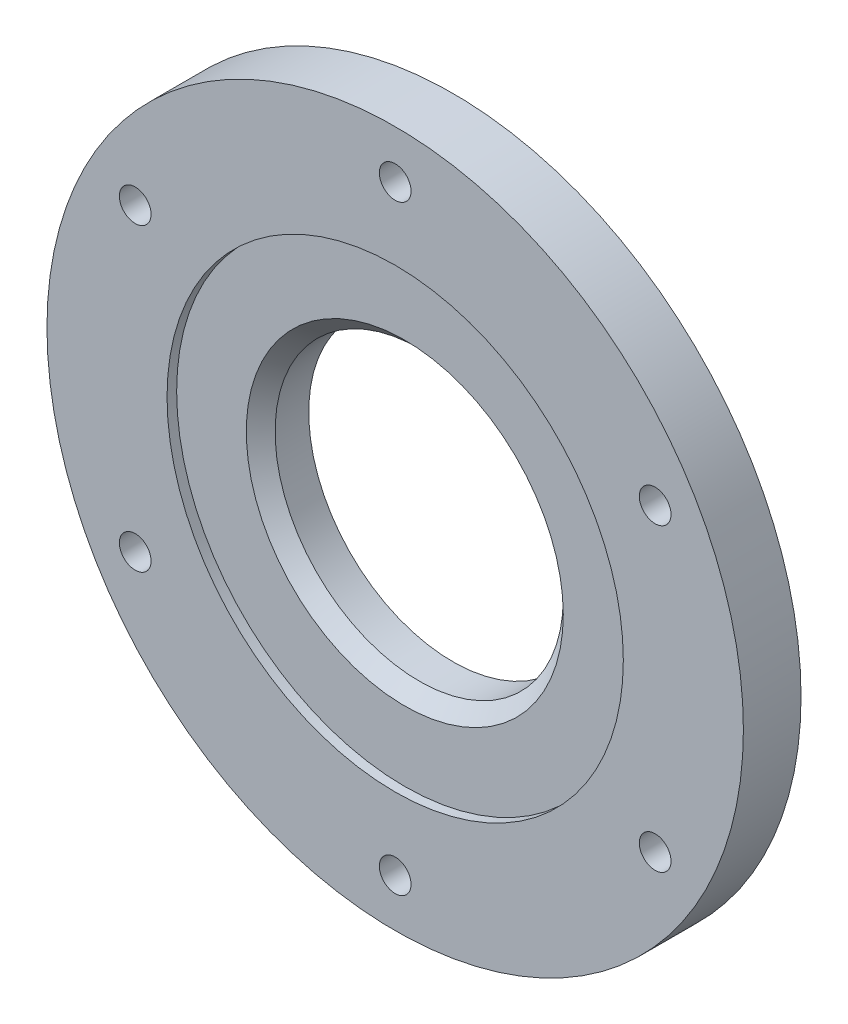
ISO-10303-21;
HEADER;
FILE_DESCRIPTION(('STEP AP214'),'2;1');
FILE_NAME('part.step','',(''),(''),'','','');
FILE_SCHEMA(('AUTOMOTIVE_DESIGN { 1 0 10303 214 1 1 1 1 }'));
ENDSEC;
DATA;
#1=APPLICATION_CONTEXT('core data for automotive mechanical design processes');
#2=APPLICATION_PROTOCOL_DEFINITION('international standard','automotive_design',2000,#1);
#3=PRODUCT_CONTEXT('',#1,'mechanical');
#4=PRODUCT('Part','Part','',(#3));
#5=PRODUCT_RELATED_PRODUCT_CATEGORY('part','',(#4));
#6=PRODUCT_DEFINITION_FORMATION('','',#4);
#7=PRODUCT_DEFINITION_CONTEXT('part definition',#1,'design');
#8=PRODUCT_DEFINITION('design','',#6,#7);
#9=PRODUCT_DEFINITION_SHAPE('','',#8);
#10=(LENGTH_UNIT() NAMED_UNIT(*) SI_UNIT(.MILLI.,.METRE.));
#11=(NAMED_UNIT(*) PLANE_ANGLE_UNIT() SI_UNIT($,.RADIAN.));
#12=(NAMED_UNIT(*) SI_UNIT($,.STERADIAN.) SOLID_ANGLE_UNIT());
#13=UNCERTAINTY_MEASURE_WITH_UNIT(LENGTH_MEASURE(1.E-05),#10,'distance_accuracy_value','');
#14=(GEOMETRIC_REPRESENTATION_CONTEXT(3) GLOBAL_UNCERTAINTY_ASSIGNED_CONTEXT((#13)) GLOBAL_UNIT_ASSIGNED_CONTEXT((#10,
#11,#12)) REPRESENTATION_CONTEXT('',''));
#15=CARTESIAN_POINT('',(0.,0.,0.));
#16=DIRECTION('',(0.,0.,1.));
#17=DIRECTION('',(1.,0.,0.));
#18=AXIS2_PLACEMENT_3D('',#15,#16,#17);
#19=CARTESIAN_POINT('',(0.,0.,-12.));
#20=DIRECTION('',(0.,0.,1.));
#21=DIRECTION('',(1.,0.,0.));
#22=AXIS2_PLACEMENT_3D('',#19,#20,#21);
#23=CYLINDRICAL_SURFACE('',#22,30.);
#24=CARTESIAN_POINT('',(0.,0.,-5.00000000000001));
#25=DIRECTION('',(0.,0.,1.));
#26=DIRECTION('',(1.,0.,0.));
#27=AXIS2_PLACEMENT_3D('',#24,#25,#26);
#28=CIRCLE('',#27,30.);
#29=CARTESIAN_POINT('',(30.,0.,-5.00000000000001));
#30=VERTEX_POINT('',#29);
#31=EDGE_CURVE('E10',#30,#30,#28,.T.);
#32=ORIENTED_EDGE('',*,*,#31,.T.);
#33=EDGE_LOOP('',(#32));
#34=FACE_BOUND('',#33,.T.);
#35=CARTESIAN_POINT('',(0.,0.,-12.));
#36=DIRECTION('',(0.,0.,1.));
#37=DIRECTION('',(1.,0.,0.));
#38=AXIS2_PLACEMENT_3D('',#35,#36,#37);
#39=CIRCLE('',#38,30.);
#40=CARTESIAN_POINT('',(30.,0.,-12.));
#41=VERTEX_POINT('',#40);
#42=EDGE_CURVE('E53',#41,#41,#39,.T.);
#43=ORIENTED_EDGE('',*,*,#42,.F.);
#44=EDGE_LOOP('',(#43));
#45=FACE_BOUND('',#44,.T.);
#46=ADVANCED_FACE('F34',(#34,#45),#23,.F.);
#47=CARTESIAN_POINT('',(0.,0.,-12.));
#48=DIRECTION('',(0.,0.,1.));
#49=DIRECTION('',(1.,0.,0.));
#50=AXIS2_PLACEMENT_3D('',#47,#48,#49);
#51=CYLINDRICAL_SURFACE('',#50,72.5);
#52=CARTESIAN_POINT('',(0.,0.,-12.));
#53=DIRECTION('',(0.,0.,1.));
#54=DIRECTION('',(1.,0.,0.));
#55=AXIS2_PLACEMENT_3D('',#52,#53,#54);
#56=CIRCLE('',#55,72.5);
#57=CARTESIAN_POINT('',(72.5,0.,-12.));
#58=VERTEX_POINT('',#57);
#59=EDGE_CURVE('E45',#58,#58,#56,.T.);
#60=ORIENTED_EDGE('',*,*,#59,.T.);
#61=EDGE_LOOP('',(#60));
#62=FACE_BOUND('',#61,.T.);
#63=CARTESIAN_POINT('',(0.,0.,0.));
#64=DIRECTION('',(0.,0.,1.));
#65=DIRECTION('',(1.,0.,0.));
#66=AXIS2_PLACEMENT_3D('',#63,#64,#65);
#67=CIRCLE('',#66,72.5);
#68=CARTESIAN_POINT('',(72.5,0.,0.));
#69=VERTEX_POINT('',#68);
#70=EDGE_CURVE('E49',#69,#69,#67,.T.);
#71=ORIENTED_EDGE('',*,*,#70,.F.);
#72=EDGE_LOOP('',(#71));
#73=FACE_BOUND('',#72,.T.);
#74=ADVANCED_FACE('F128',(#62,#73),#51,.T.);
#75=CARTESIAN_POINT('',(0.,0.,-12.));
#76=DIRECTION('',(0.,0.,1.));
#77=DIRECTION('',(1.,0.,0.));
#78=AXIS2_PLACEMENT_3D('',#75,#76,#77);
#79=PLANE('',#78);
#80=CARTESIAN_POINT('',(54.126587736527,31.2500000000006,-12.));
#81=DIRECTION('',(0.,0.,-1.));
#82=DIRECTION('',(-1.,0.,0.));
#83=AXIS2_PLACEMENT_3D('',#80,#81,#82);
#84=CIRCLE('',#83,3.3);
#85=CARTESIAN_POINT('',(50.8265877365271,31.2500000000006,-12.));
#86=VERTEX_POINT('',#85);
#87=EDGE_CURVE('E90',#86,#86,#84,.T.);
#88=ORIENTED_EDGE('',*,*,#87,.F.);
#89=EDGE_LOOP('',(#88));
#90=FACE_BOUND('',#89,.T.);
#91=CARTESIAN_POINT('',(54.1265877365277,-31.2499999999995,-12.));
#92=DIRECTION('',(0.,0.,-1.));
#93=DIRECTION('',(-1.,0.,0.));
#94=AXIS2_PLACEMENT_3D('',#91,#92,#93);
#95=CIRCLE('',#94,3.3);
#96=CARTESIAN_POINT('',(50.8265877365277,-31.2499999999995,-12.));
#97=VERTEX_POINT('',#96);
#98=EDGE_CURVE('E84',#97,#97,#95,.T.);
#99=ORIENTED_EDGE('',*,*,#98,.F.);
#100=EDGE_LOOP('',(#99));
#101=FACE_BOUND('',#100,.T.);
#102=CARTESIAN_POINT('',(0.,-62.5,-12.));
#103=DIRECTION('',(0.,0.,-1.));
#104=DIRECTION('',(-1.,0.,0.));
#105=AXIS2_PLACEMENT_3D('',#102,#103,#104);
#106=CIRCLE('',#105,3.3);
#107=CARTESIAN_POINT('',(-3.3,-62.5,-12.));
#108=VERTEX_POINT('',#107);
#109=EDGE_CURVE('E78',#108,#108,#106,.T.);
#110=ORIENTED_EDGE('',*,*,#109,.F.);
#111=EDGE_LOOP('',(#110));
#112=FACE_BOUND('',#111,.T.);
#113=CARTESIAN_POINT('',(-54.1265877365273,-31.2500000000003,-12.));
#114=DIRECTION('',(0.,0.,-1.));
#115=DIRECTION('',(-1.,0.,0.));
#116=AXIS2_PLACEMENT_3D('',#113,#114,#115);
#117=CIRCLE('',#116,3.3);
#118=CARTESIAN_POINT('',(-57.4265877365273,-31.2500000000003,-12.));
#119=VERTEX_POINT('',#118);
#120=EDGE_CURVE('E72',#119,#119,#117,.T.);
#121=ORIENTED_EDGE('',*,*,#120,.F.);
#122=EDGE_LOOP('',(#121));
#123=FACE_BOUND('',#122,.T.);
#124=CARTESIAN_POINT('',(-54.1265877365275,31.2499999999999,-12.));
#125=DIRECTION('',(0.,0.,-1.));
#126=DIRECTION('',(-1.,0.,0.));
#127=AXIS2_PLACEMENT_3D('',#124,#125,#126);
#128=CIRCLE('',#127,3.3);
#129=CARTESIAN_POINT('',(-57.4265877365275,31.2499999999999,-12.));
#130=VERTEX_POINT('',#129);
#131=EDGE_CURVE('E66',#130,#130,#128,.T.);
#132=ORIENTED_EDGE('',*,*,#131,.F.);
#133=EDGE_LOOP('',(#132));
#134=FACE_BOUND('',#133,.T.);
#135=CARTESIAN_POINT('',(0.,62.5,-12.));
#136=DIRECTION('',(0.,0.,-1.));
#137=DIRECTION('',(-1.,0.,0.));
#138=AXIS2_PLACEMENT_3D('',#135,#136,#137);
#139=CIRCLE('',#138,3.3);
#140=CARTESIAN_POINT('',(-3.3,62.5,-12.));
#141=VERTEX_POINT('',#140);
#142=EDGE_CURVE('E60',#141,#141,#139,.T.);
#143=ORIENTED_EDGE('',*,*,#142,.F.);
#144=EDGE_LOOP('',(#143));
#145=FACE_BOUND('',#144,.T.);
#146=ORIENTED_EDGE('',*,*,#42,.T.);
#147=EDGE_LOOP('',(#146));
#148=FACE_BOUND('',#147,.T.);
#149=ORIENTED_EDGE('',*,*,#59,.F.);
#150=EDGE_LOOP('',(#149));
#151=FACE_BOUND('',#150,.T.);
#152=ADVANCED_FACE('F112',(#90,#101,#112,#123,#134,#145,#148,#151),#79,.F.);
#153=CARTESIAN_POINT('',(0.,0.,0.));
#154=DIRECTION('',(0.,0.,1.));
#155=DIRECTION('',(1.,0.,0.));
#156=AXIS2_PLACEMENT_3D('',#153,#154,#155);
#157=PLANE('',#156);
#158=CARTESIAN_POINT('',(0.,0.,0.));
#159=DIRECTION('',(0.,0.,1.));
#160=DIRECTION('',(1.,0.,0.));
#161=AXIS2_PLACEMENT_3D('',#158,#159,#160);
#162=CIRCLE('',#161,47.5);
#163=CARTESIAN_POINT('',(47.5,0.,0.));
#164=VERTEX_POINT('',#163);
#165=EDGE_CURVE('E94',#164,#164,#162,.T.);
#166=ORIENTED_EDGE('',*,*,#165,.F.);
#167=EDGE_LOOP('',(#166));
#168=FACE_BOUND('',#167,.T.);
#169=CARTESIAN_POINT('',(54.126587736527,31.2500000000006,0.));
#170=DIRECTION('',(0.,0.,-1.));
#171=DIRECTION('',(-1.,0.,0.));
#172=AXIS2_PLACEMENT_3D('',#169,#170,#171);
#173=CIRCLE('',#172,3.3);
#174=CARTESIAN_POINT('',(50.8265877365271,31.2500000000006,0.));
#175=VERTEX_POINT('',#174);
#176=EDGE_CURVE('E87',#175,#175,#173,.T.);
#177=ORIENTED_EDGE('',*,*,#176,.T.);
#178=EDGE_LOOP('',(#177));
#179=FACE_BOUND('',#178,.T.);
#180=CARTESIAN_POINT('',(54.1265877365277,-31.2499999999995,0.));
#181=DIRECTION('',(0.,0.,-1.));
#182=DIRECTION('',(-1.,0.,0.));
#183=AXIS2_PLACEMENT_3D('',#180,#181,#182);
#184=CIRCLE('',#183,3.3);
#185=CARTESIAN_POINT('',(50.8265877365277,-31.2499999999995,0.));
#186=VERTEX_POINT('',#185);
#187=EDGE_CURVE('E81',#186,#186,#184,.T.);
#188=ORIENTED_EDGE('',*,*,#187,.T.);
#189=EDGE_LOOP('',(#188));
#190=FACE_BOUND('',#189,.T.);
#191=CARTESIAN_POINT('',(0.,-62.5,0.));
#192=DIRECTION('',(0.,0.,-1.));
#193=DIRECTION('',(-1.,0.,0.));
#194=AXIS2_PLACEMENT_3D('',#191,#192,#193);
#195=CIRCLE('',#194,3.3);
#196=CARTESIAN_POINT('',(-3.3,-62.5,0.));
#197=VERTEX_POINT('',#196);
#198=EDGE_CURVE('E75',#197,#197,#195,.T.);
#199=ORIENTED_EDGE('',*,*,#198,.T.);
#200=EDGE_LOOP('',(#199));
#201=FACE_BOUND('',#200,.T.);
#202=CARTESIAN_POINT('',(-54.1265877365273,-31.2500000000003,0.));
#203=DIRECTION('',(0.,0.,-1.));
#204=DIRECTION('',(-1.,0.,0.));
#205=AXIS2_PLACEMENT_3D('',#202,#203,#204);
#206=CIRCLE('',#205,3.3);
#207=CARTESIAN_POINT('',(-57.4265877365273,-31.2500000000003,0.));
#208=VERTEX_POINT('',#207);
#209=EDGE_CURVE('E69',#208,#208,#206,.T.);
#210=ORIENTED_EDGE('',*,*,#209,.T.);
#211=EDGE_LOOP('',(#210));
#212=FACE_BOUND('',#211,.T.);
#213=CARTESIAN_POINT('',(-54.1265877365275,31.2499999999999,0.));
#214=DIRECTION('',(0.,0.,-1.));
#215=DIRECTION('',(-1.,0.,0.));
#216=AXIS2_PLACEMENT_3D('',#213,#214,#215);
#217=CIRCLE('',#216,3.3);
#218=CARTESIAN_POINT('',(-57.4265877365275,31.2499999999999,0.));
#219=VERTEX_POINT('',#218);
#220=EDGE_CURVE('E63',#219,#219,#217,.T.);
#221=ORIENTED_EDGE('',*,*,#220,.T.);
#222=EDGE_LOOP('',(#221));
#223=FACE_BOUND('',#222,.T.);
#224=CARTESIAN_POINT('',(0.,62.5,0.));
#225=DIRECTION('',(0.,0.,-1.));
#226=DIRECTION('',(-1.,0.,0.));
#227=AXIS2_PLACEMENT_3D('',#224,#225,#226);
#228=CIRCLE('',#227,3.3);
#229=CARTESIAN_POINT('',(-3.3,62.5,0.));
#230=VERTEX_POINT('',#229);
#231=EDGE_CURVE('E57',#230,#230,#228,.T.);
#232=ORIENTED_EDGE('',*,*,#231,.T.);
#233=EDGE_LOOP('',(#232));
#234=FACE_BOUND('',#233,.T.);
#235=ORIENTED_EDGE('',*,*,#70,.T.);
#236=EDGE_LOOP('',(#235));
#237=FACE_BOUND('',#236,.T.);
#238=ADVANCED_FACE('F108',(#168,#179,#190,#201,#212,#223,#234,#237),#157,.T.);
#239=CARTESIAN_POINT('',(0.,62.5,-12.));
#240=DIRECTION('',(0.,0.,-1.));
#241=DIRECTION('',(-1.,0.,0.));
#242=AXIS2_PLACEMENT_3D('',#239,#240,#241);
#243=CYLINDRICAL_SURFACE('',#242,3.3);
#244=ORIENTED_EDGE('',*,*,#231,.F.);
#245=EDGE_LOOP('',(#244));
#246=FACE_BOUND('',#245,.T.);
#247=ORIENTED_EDGE('',*,*,#142,.T.);
#248=EDGE_LOOP('',(#247));
#249=FACE_BOUND('',#248,.T.);
#250=ADVANCED_FACE('F111',(#246,#249),#243,.F.);
#251=CARTESIAN_POINT('',(-54.1265877365275,31.2499999999999,-12.));
#252=DIRECTION('',(0.,0.,-1.));
#253=DIRECTION('',(-1.,0.,0.));
#254=AXIS2_PLACEMENT_3D('',#251,#252,#253);
#255=CYLINDRICAL_SURFACE('',#254,3.3);
#256=ORIENTED_EDGE('',*,*,#220,.F.);
#257=EDGE_LOOP('',(#256));
#258=FACE_BOUND('',#257,.T.);
#259=ORIENTED_EDGE('',*,*,#131,.T.);
#260=EDGE_LOOP('',(#259));
#261=FACE_BOUND('',#260,.T.);
#262=ADVANCED_FACE('F141',(#258,#261),#255,.F.);
#263=CARTESIAN_POINT('',(-54.1265877365273,-31.2500000000003,-12.));
#264=DIRECTION('',(0.,0.,-1.));
#265=DIRECTION('',(-1.,0.,0.));
#266=AXIS2_PLACEMENT_3D('',#263,#264,#265);
#267=CYLINDRICAL_SURFACE('',#266,3.3);
#268=ORIENTED_EDGE('',*,*,#209,.F.);
#269=EDGE_LOOP('',(#268));
#270=FACE_BOUND('',#269,.T.);
#271=ORIENTED_EDGE('',*,*,#120,.T.);
#272=EDGE_LOOP('',(#271));
#273=FACE_BOUND('',#272,.T.);
#274=ADVANCED_FACE('F145',(#270,#273),#267,.F.);
#275=CARTESIAN_POINT('',(0.,-62.5,-12.));
#276=DIRECTION('',(0.,0.,-1.));
#277=DIRECTION('',(-1.,0.,0.));
#278=AXIS2_PLACEMENT_3D('',#275,#276,#277);
#279=CYLINDRICAL_SURFACE('',#278,3.3);
#280=ORIENTED_EDGE('',*,*,#198,.F.);
#281=EDGE_LOOP('',(#280));
#282=FACE_BOUND('',#281,.T.);
#283=ORIENTED_EDGE('',*,*,#109,.T.);
#284=EDGE_LOOP('',(#283));
#285=FACE_BOUND('',#284,.T.);
#286=ADVANCED_FACE('F149',(#282,#285),#279,.F.);
#287=CARTESIAN_POINT('',(54.1265877365277,-31.2499999999995,-12.));
#288=DIRECTION('',(0.,0.,-1.));
#289=DIRECTION('',(-1.,0.,0.));
#290=AXIS2_PLACEMENT_3D('',#287,#288,#289);
#291=CYLINDRICAL_SURFACE('',#290,3.3);
#292=ORIENTED_EDGE('',*,*,#187,.F.);
#293=EDGE_LOOP('',(#292));
#294=FACE_BOUND('',#293,.T.);
#295=ORIENTED_EDGE('',*,*,#98,.T.);
#296=EDGE_LOOP('',(#295));
#297=FACE_BOUND('',#296,.T.);
#298=ADVANCED_FACE('F153',(#294,#297),#291,.F.);
#299=CARTESIAN_POINT('',(54.126587736527,31.2500000000006,-12.));
#300=DIRECTION('',(0.,0.,-1.));
#301=DIRECTION('',(-1.,0.,0.));
#302=AXIS2_PLACEMENT_3D('',#299,#300,#301);
#303=CYLINDRICAL_SURFACE('',#302,3.3);
#304=ORIENTED_EDGE('',*,*,#176,.F.);
#305=EDGE_LOOP('',(#304));
#306=FACE_BOUND('',#305,.T.);
#307=ORIENTED_EDGE('',*,*,#87,.T.);
#308=EDGE_LOOP('',(#307));
#309=FACE_BOUND('',#308,.T.);
#310=ADVANCED_FACE('F157',(#306,#309),#303,.F.);
#311=CARTESIAN_POINT('',(0.,0.,-2.));
#312=DIRECTION('',(0.,0.,1.));
#313=DIRECTION('',(1.,0.,0.));
#314=AXIS2_PLACEMENT_3D('',#311,#312,#313);
#315=PLANE('',#314);
#316=CARTESIAN_POINT('',(0.,0.,-2.));
#317=DIRECTION('',(0.,0.,1.));
#318=DIRECTION('',(1.,0.,0.));
#319=AXIS2_PLACEMENT_3D('',#316,#317,#318);
#320=CIRCLE('',#319,33.);
#321=CARTESIAN_POINT('',(33.,0.,-2.));
#322=VERTEX_POINT('',#321);
#323=EDGE_CURVE('E41',#322,#322,#320,.F.);
#324=ORIENTED_EDGE('',*,*,#323,.T.);
#325=EDGE_LOOP('',(#324));
#326=FACE_BOUND('',#325,.T.);
#327=CARTESIAN_POINT('',(0.,0.,-2.));
#328=DIRECTION('',(0.,0.,1.));
#329=DIRECTION('',(1.,0.,0.));
#330=AXIS2_PLACEMENT_3D('',#327,#328,#329);
#331=CIRCLE('',#330,47.5);
#332=CARTESIAN_POINT('',(47.5,0.,-2.));
#333=VERTEX_POINT('',#332);
#334=EDGE_CURVE('E93',#333,#333,#331,.T.);
#335=ORIENTED_EDGE('',*,*,#334,.T.);
#336=EDGE_LOOP('',(#335));
#337=FACE_BOUND('',#336,.T.);
#338=ADVANCED_FACE('F100',(#326,#337),#315,.T.);
#339=CARTESIAN_POINT('',(0.,0.,-2.));
#340=DIRECTION('',(0.,0.,1.));
#341=DIRECTION('',(1.,0.,0.));
#342=AXIS2_PLACEMENT_3D('',#339,#340,#341);
#343=CYLINDRICAL_SURFACE('',#342,47.5);
#344=ORIENTED_EDGE('',*,*,#334,.F.);
#345=EDGE_LOOP('',(#344));
#346=FACE_BOUND('',#345,.T.);
#347=ORIENTED_EDGE('',*,*,#165,.T.);
#348=EDGE_LOOP('',(#347));
#349=FACE_BOUND('',#348,.T.);
#350=ADVANCED_FACE('F102',(#346,#349),#343,.F.);
#351=CARTESIAN_POINT('',(0.,0.,-2.));
#352=DIRECTION('',(0.,0.,1.));
#353=DIRECTION('',(1.,0.,0.));
#354=AXIS2_PLACEMENT_3D('',#351,#352,#353);
#355=CONICAL_SURFACE('',#354,33.,0.785398163397443);
#356=ORIENTED_EDGE('',*,*,#31,.F.);
#357=EDGE_LOOP('',(#356));
#358=FACE_BOUND('',#357,.T.);
#359=ORIENTED_EDGE('',*,*,#323,.F.);
#360=EDGE_LOOP('',(#359));
#361=FACE_BOUND('',#360,.T.);
#362=ADVANCED_FACE('F36',(#358,#361),#355,.F.);
#363=CLOSED_SHELL('',(#46,#74,#152,#238,#250,#262,#274,#286,#298,#310,#338,#350,#362));
#364=MANIFOLD_SOLID_BREP('B2',#363);
#365=ADVANCED_BREP_SHAPE_REPRESENTATION('',(#18,#364),#14);
#366=SHAPE_DEFINITION_REPRESENTATION(#9,#365);
ENDSEC;
END-ISO-10303-21;
